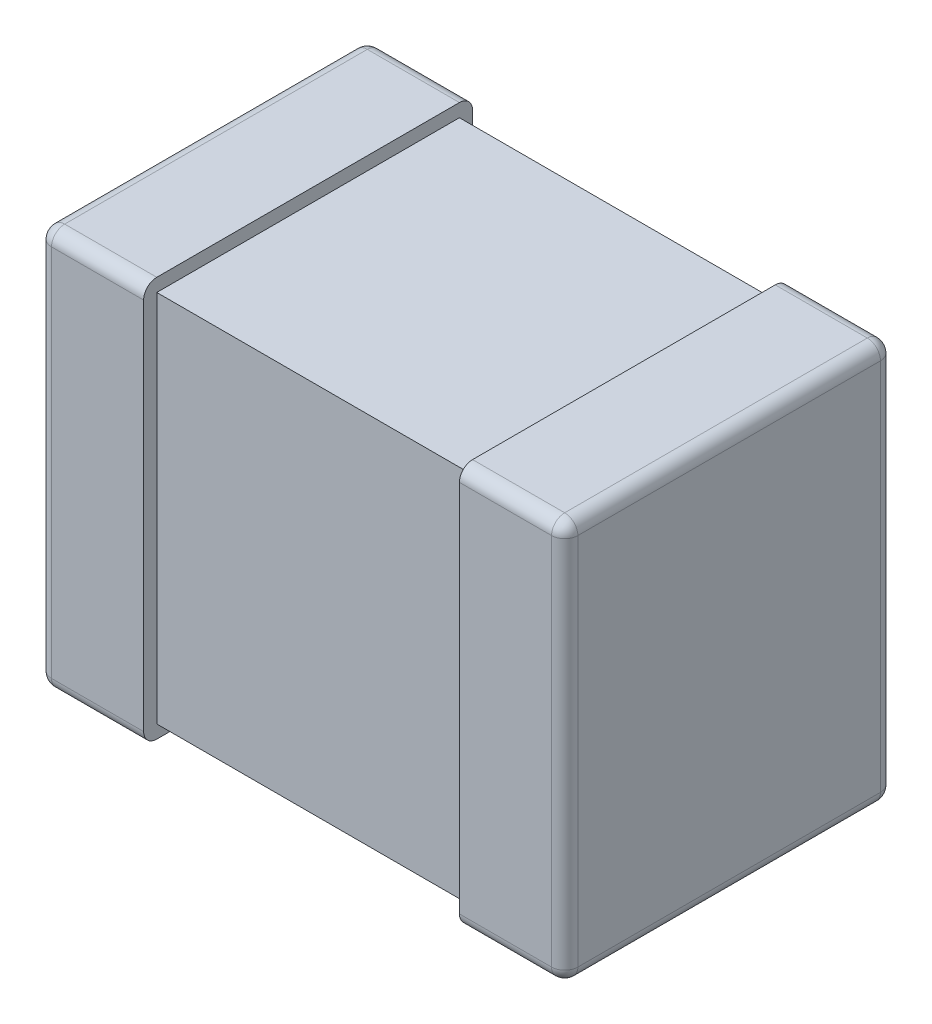
ISO-10303-21;
HEADER;
FILE_DESCRIPTION(('STEP AP214'),'2;1');
FILE_NAME('part.step','',(''),(''),'','','');
FILE_SCHEMA(('AUTOMOTIVE_DESIGN { 1 0 10303 214 1 1 1 1 }'));
ENDSEC;
DATA;
#1=APPLICATION_CONTEXT('core data for automotive mechanical design processes');
#2=APPLICATION_PROTOCOL_DEFINITION('international standard','automotive_design',2000,#1);
#3=PRODUCT_CONTEXT('',#1,'mechanical');
#4=PRODUCT('Part','Part','',(#3));
#5=PRODUCT_RELATED_PRODUCT_CATEGORY('part','',(#4));
#6=PRODUCT_DEFINITION_FORMATION('','',#4);
#7=PRODUCT_DEFINITION_CONTEXT('part definition',#1,'design');
#8=PRODUCT_DEFINITION('design','',#6,#7);
#9=PRODUCT_DEFINITION_SHAPE('','',#8);
#10=(LENGTH_UNIT() NAMED_UNIT(*) SI_UNIT(.MILLI.,.METRE.));
#11=(NAMED_UNIT(*) PLANE_ANGLE_UNIT() SI_UNIT($,.RADIAN.));
#12=(NAMED_UNIT(*) SI_UNIT($,.STERADIAN.) SOLID_ANGLE_UNIT());
#13=UNCERTAINTY_MEASURE_WITH_UNIT(LENGTH_MEASURE(1.E-05),#10,'distance_accuracy_value','');
#14=(GEOMETRIC_REPRESENTATION_CONTEXT(3) GLOBAL_UNCERTAINTY_ASSIGNED_CONTEXT((#13)) GLOBAL_UNIT_ASSIGNED_CONTEXT((#10,
#11,#12)) REPRESENTATION_CONTEXT('',''));
#15=CARTESIAN_POINT('',(0.,0.,0.));
#16=DIRECTION('',(0.,0.,1.));
#17=DIRECTION('',(1.,0.,0.));
#18=AXIS2_PLACEMENT_3D('',#15,#16,#17);
#19=CARTESIAN_POINT('',(-1.,1.52,-0.625));
#20=DIRECTION('',(1.,0.,0.));
#21=DIRECTION('',(0.,0.,-1.));
#22=AXIS2_PLACEMENT_3D('',#19,#20,#21);
#23=PLANE('',#22);
#24=DIRECTION('',(0.,-1.,0.));
#25=VECTOR('',#24,1.);
#26=CARTESIAN_POINT('',(-1.,1.52,-0.575));
#27=LINE('',#26,#25);
#28=CARTESIAN_POINT('',(-1.,0.0499999999999999,-0.575));
#29=VERTEX_POINT('',#28);
#30=CARTESIAN_POINT('',(-1.,1.47,-0.575));
#31=VERTEX_POINT('',#30);
#32=EDGE_CURVE('E436',#29,#31,#27,.F.);
#33=ORIENTED_EDGE('',*,*,#32,.F.);
#34=DIRECTION('',(0.,0.,1.));
#35=VECTOR('',#34,1.);
#36=CARTESIAN_POINT('',(-1.,0.0499999999999999,-0.625));
#37=LINE('',#36,#35);
#38=CARTESIAN_POINT('',(-1.,0.0499999999999999,0.575));
#39=VERTEX_POINT('',#38);
#40=EDGE_CURVE('E318',#39,#29,#37,.F.);
#41=ORIENTED_EDGE('',*,*,#40,.F.);
#42=DIRECTION('',(0.,-1.,0.));
#43=VECTOR('',#42,1.);
#44=CARTESIAN_POINT('',(-1.,1.52,0.575));
#45=LINE('',#44,#43);
#46=CARTESIAN_POINT('',(-1.,1.47,0.575));
#47=VERTEX_POINT('',#46);
#48=EDGE_CURVE('E447',#47,#39,#45,.T.);
#49=ORIENTED_EDGE('',*,*,#48,.F.);
#50=DIRECTION('',(0.,0.,-1.));
#51=VECTOR('',#50,1.);
#52=CARTESIAN_POINT('',(-1.,1.47,0.625));
#53=LINE('',#52,#51);
#54=EDGE_CURVE('E368',#31,#47,#53,.F.);
#55=ORIENTED_EDGE('',*,*,#54,.F.);
#56=EDGE_LOOP('',(#33,#41,#49,#55));
#57=FACE_BOUND('',#56,.T.);
#58=ADVANCED_FACE('F16',(#57),#23,.F.);
#59=CARTESIAN_POINT('',(1.,1.52,-0.625));
#60=DIRECTION('',(-1.,0.,0.));
#61=DIRECTION('',(0.,0.,1.));
#62=AXIS2_PLACEMENT_3D('',#59,#60,#61);
#63=PLANE('',#62);
#64=DIRECTION('',(0.,-1.,0.));
#65=VECTOR('',#64,1.);
#66=CARTESIAN_POINT('',(1.,1.52,0.575));
#67=LINE('',#66,#65);
#68=CARTESIAN_POINT('',(1.,0.0499999999999999,0.575));
#69=VERTEX_POINT('',#68);
#70=CARTESIAN_POINT('',(1.,1.47,0.575));
#71=VERTEX_POINT('',#70);
#72=EDGE_CURVE('E325',#69,#71,#67,.F.);
#73=ORIENTED_EDGE('',*,*,#72,.F.);
#74=DIRECTION('',(0.,0.,-1.));
#75=VECTOR('',#74,1.);
#76=CARTESIAN_POINT('',(1.,0.0499999999999999,-0.625));
#77=LINE('',#76,#75);
#78=CARTESIAN_POINT('',(1.,0.0499999999999999,-0.575));
#79=VERTEX_POINT('',#78);
#80=EDGE_CURVE('E317',#79,#69,#77,.F.);
#81=ORIENTED_EDGE('',*,*,#80,.F.);
#82=DIRECTION('',(0.,-1.,0.));
#83=VECTOR('',#82,1.);
#84=CARTESIAN_POINT('',(1.,1.52,-0.575));
#85=LINE('',#84,#83);
#86=CARTESIAN_POINT('',(1.,1.47,-0.575));
#87=VERTEX_POINT('',#86);
#88=EDGE_CURVE('E186',#87,#79,#85,.T.);
#89=ORIENTED_EDGE('',*,*,#88,.F.);
#90=DIRECTION('',(0.,0.,1.));
#91=VECTOR('',#90,1.);
#92=CARTESIAN_POINT('',(1.,1.47,0.625));
#93=LINE('',#92,#91);
#94=EDGE_CURVE('E417',#71,#87,#93,.F.);
#95=ORIENTED_EDGE('',*,*,#94,.F.);
#96=EDGE_LOOP('',(#73,#81,#89,#95));
#97=FACE_BOUND('',#96,.T.);
#98=ADVANCED_FACE('F404',(#97),#63,.F.);
#99=CARTESIAN_POINT('',(-0.95,0.05,0.575));
#100=DIRECTION('',(1.,0.,0.));
#101=DIRECTION('',(0.,0.,-1.));
#102=AXIS2_PLACEMENT_3D('',#99,#100,#101);
#103=SPHERICAL_SURFACE('',#102,0.05);
#104=CARTESIAN_POINT('',(-0.95,0.0499999999999999,0.575));
#105=DIRECTION('',(0.,-1.,0.));
#106=DIRECTION('',(0.,0.,-1.));
#107=AXIS2_PLACEMENT_3D('',#104,#105,#106);
#108=CIRCLE('',#107,0.05);
#109=CARTESIAN_POINT('',(-0.95,0.0499999999999999,0.625));
#110=VERTEX_POINT('',#109);
#111=EDGE_CURVE('E450',#39,#110,#108,.F.);
#112=ORIENTED_EDGE('',*,*,#111,.F.);
#113=CARTESIAN_POINT('',(-0.95,0.0499999999999999,0.575));
#114=DIRECTION('',(0.,0.,1.));
#115=DIRECTION('',(1.,0.,0.));
#116=AXIS2_PLACEMENT_3D('',#113,#114,#115);
#117=CIRCLE('',#116,0.05);
#118=CARTESIAN_POINT('',(-0.95,0.,0.575));
#119=VERTEX_POINT('',#118);
#120=EDGE_CURVE('E328',#119,#39,#117,.F.);
#121=ORIENTED_EDGE('',*,*,#120,.F.);
#122=CARTESIAN_POINT('',(-0.95,0.0499999999999999,0.575));
#123=DIRECTION('',(1.,0.,0.));
#124=DIRECTION('',(0.,0.,-1.));
#125=AXIS2_PLACEMENT_3D('',#122,#123,#124);
#126=CIRCLE('',#125,0.05);
#127=EDGE_CURVE('E321',#110,#119,#126,.T.);
#128=ORIENTED_EDGE('',*,*,#127,.F.);
#129=EDGE_LOOP('',(#112,#121,#128));
#130=FACE_BOUND('',#129,.T.);
#131=ADVANCED_FACE('F400',(#130),#103,.T.);
#132=CARTESIAN_POINT('',(-0.95,1.52,0.575));
#133=DIRECTION('',(0.,-1.,0.));
#134=DIRECTION('',(0.,0.,-1.));
#135=AXIS2_PLACEMENT_3D('',#132,#133,#134);
#136=CYLINDRICAL_SURFACE('',#135,0.05);
#137=CARTESIAN_POINT('',(-0.95,1.47,0.575));
#138=DIRECTION('',(0.,-1.,0.));
#139=DIRECTION('',(1.,0.,0.));
#140=AXIS2_PLACEMENT_3D('',#137,#138,#139);
#141=CIRCLE('',#140,0.05);
#142=CARTESIAN_POINT('',(-0.95,1.47,0.625));
#143=VERTEX_POINT('',#142);
#144=EDGE_CURVE('E382',#47,#143,#141,.F.);
#145=ORIENTED_EDGE('',*,*,#144,.F.);
#146=ORIENTED_EDGE('',*,*,#48,.T.);
#147=ORIENTED_EDGE('',*,*,#111,.T.);
#148=DIRECTION('',(0.,1.,0.));
#149=VECTOR('',#148,1.);
#150=CARTESIAN_POINT('',(-0.95,1.52,0.625));
#151=LINE('',#150,#149);
#152=EDGE_CURVE('E376',#110,#143,#151,.T.);
#153=ORIENTED_EDGE('',*,*,#152,.T.);
#154=EDGE_LOOP('',(#145,#146,#147,#153));
#155=FACE_BOUND('',#154,.T.);
#156=ADVANCED_FACE('F396',(#155),#136,.T.);
#157=CARTESIAN_POINT('',(-0.95,1.47,0.575));
#158=DIRECTION('',(1.,0.,0.));
#159=DIRECTION('',(0.,0.,-1.));
#160=AXIS2_PLACEMENT_3D('',#157,#158,#159);
#161=SPHERICAL_SURFACE('',#160,0.05);
#162=CARTESIAN_POINT('',(-0.95,1.47,0.575));
#163=DIRECTION('',(-1.,0.,0.));
#164=DIRECTION('',(0.,0.,1.));
#165=AXIS2_PLACEMENT_3D('',#162,#163,#164);
#166=CIRCLE('',#165,0.05);
#167=CARTESIAN_POINT('',(-0.95,1.52,0.575));
#168=VERTEX_POINT('',#167);
#169=EDGE_CURVE('E371',#168,#143,#166,.F.);
#170=ORIENTED_EDGE('',*,*,#169,.F.);
#171=CARTESIAN_POINT('',(-0.95,1.47,0.575));
#172=DIRECTION('',(0.,0.,-1.));
#173=DIRECTION('',(-1.,0.,0.));
#174=AXIS2_PLACEMENT_3D('',#171,#172,#173);
#175=CIRCLE('',#174,0.05);
#176=EDGE_CURVE('E379',#47,#168,#175,.T.);
#177=ORIENTED_EDGE('',*,*,#176,.F.);
#178=ORIENTED_EDGE('',*,*,#144,.T.);
#179=EDGE_LOOP('',(#170,#177,#178));
#180=FACE_BOUND('',#179,.T.);
#181=ADVANCED_FACE('F393',(#180),#161,.T.);
#182=CARTESIAN_POINT('',(-0.95,1.47,0.625));
#183=DIRECTION('',(0.,0.,-1.));
#184=DIRECTION('',(-1.,0.,0.));
#185=AXIS2_PLACEMENT_3D('',#182,#183,#184);
#186=CYLINDRICAL_SURFACE('',#185,0.05);
#187=CARTESIAN_POINT('',(-0.95,1.47,-0.575));
#188=DIRECTION('',(0.,0.,1.));
#189=DIRECTION('',(1.,0.,0.));
#190=AXIS2_PLACEMENT_3D('',#187,#188,#189);
#191=CIRCLE('',#190,0.05);
#192=CARTESIAN_POINT('',(-0.95,1.52,-0.575));
#193=VERTEX_POINT('',#192);
#194=EDGE_CURVE('E364',#31,#193,#191,.F.);
#195=ORIENTED_EDGE('',*,*,#194,.F.);
#196=ORIENTED_EDGE('',*,*,#54,.T.);
#197=ORIENTED_EDGE('',*,*,#176,.T.);
#198=DIRECTION('',(0.,0.,1.));
#199=VECTOR('',#198,1.);
#200=CARTESIAN_POINT('',(-0.95,1.52,0.625));
#201=LINE('',#200,#199);
#202=EDGE_CURVE('E571',#193,#168,#201,.T.);
#203=ORIENTED_EDGE('',*,*,#202,.F.);
#204=EDGE_LOOP('',(#195,#196,#197,#203));
#205=FACE_BOUND('',#204,.T.);
#206=ADVANCED_FACE('F356',(#205),#186,.T.);
#207=CARTESIAN_POINT('',(-0.95,1.47,-0.575));
#208=DIRECTION('',(1.,0.,0.));
#209=DIRECTION('',(0.,0.,-1.));
#210=AXIS2_PLACEMENT_3D('',#207,#208,#209);
#211=SPHERICAL_SURFACE('',#210,0.05);
#212=CARTESIAN_POINT('',(-0.95,1.47,-0.575));
#213=DIRECTION('',(1.,0.,0.));
#214=DIRECTION('',(0.,0.,-1.));
#215=AXIS2_PLACEMENT_3D('',#212,#213,#214);
#216=CIRCLE('',#215,0.05);
#217=CARTESIAN_POINT('',(-0.95,1.47,-0.625));
#218=VERTEX_POINT('',#217);
#219=EDGE_CURVE('E565',#218,#193,#216,.T.);
#220=ORIENTED_EDGE('',*,*,#219,.F.);
#221=CARTESIAN_POINT('',(-0.95,1.47,-0.575));
#222=DIRECTION('',(0.,-1.,0.));
#223=DIRECTION('',(0.,0.,-1.));
#224=AXIS2_PLACEMENT_3D('',#221,#222,#223);
#225=CIRCLE('',#224,0.05);
#226=EDGE_CURVE('E367',#31,#218,#225,.T.);
#227=ORIENTED_EDGE('',*,*,#226,.F.);
#228=ORIENTED_EDGE('',*,*,#194,.T.);
#229=EDGE_LOOP('',(#220,#227,#228));
#230=FACE_BOUND('',#229,.T.);
#231=ADVANCED_FACE('F351',(#230),#211,.T.);
#232=CARTESIAN_POINT('',(-0.95,1.52,-0.575));
#233=DIRECTION('',(0.,-1.,0.));
#234=DIRECTION('',(0.,0.,-1.));
#235=AXIS2_PLACEMENT_3D('',#232,#233,#234);
#236=CYLINDRICAL_SURFACE('',#235,0.05);
#237=CARTESIAN_POINT('',(-0.95,0.05,-0.575));
#238=DIRECTION('',(0.,1.,0.));
#239=DIRECTION('',(1.,0.,0.));
#240=AXIS2_PLACEMENT_3D('',#237,#238,#239);
#241=CIRCLE('',#240,0.05);
#242=CARTESIAN_POINT('',(-0.95,0.0499999999999999,-0.625));
#243=VERTEX_POINT('',#242);
#244=EDGE_CURVE('E332',#29,#243,#241,.F.);
#245=ORIENTED_EDGE('',*,*,#244,.F.);
#246=ORIENTED_EDGE('',*,*,#32,.T.);
#247=ORIENTED_EDGE('',*,*,#226,.T.);
#248=DIRECTION('',(0.,1.,0.));
#249=VECTOR('',#248,1.);
#250=CARTESIAN_POINT('',(-0.95,1.52,-0.625));
#251=LINE('',#250,#249);
#252=EDGE_CURVE('E303',#218,#243,#251,.F.);
#253=ORIENTED_EDGE('',*,*,#252,.T.);
#254=EDGE_LOOP('',(#245,#246,#247,#253));
#255=FACE_BOUND('',#254,.T.);
#256=ADVANCED_FACE('F347',(#255),#236,.T.);
#257=CARTESIAN_POINT('',(-0.95,0.05,-0.575));
#258=DIRECTION('',(1.,0.,0.));
#259=DIRECTION('',(0.,0.,-1.));
#260=AXIS2_PLACEMENT_3D('',#257,#258,#259);
#261=SPHERICAL_SURFACE('',#260,0.05);
#262=CARTESIAN_POINT('',(-0.95,0.0499999999999999,-0.575));
#263=DIRECTION('',(0.,0.,1.));
#264=DIRECTION('',(1.,0.,0.));
#265=AXIS2_PLACEMENT_3D('',#262,#263,#264);
#266=CIRCLE('',#265,0.05);
#267=CARTESIAN_POINT('',(-0.95,0.,-0.575));
#268=VERTEX_POINT('',#267);
#269=EDGE_CURVE('E314',#29,#268,#266,.T.);
#270=ORIENTED_EDGE('',*,*,#269,.F.);
#271=ORIENTED_EDGE('',*,*,#244,.T.);
#272=CARTESIAN_POINT('',(-0.95,0.0499999999999999,-0.575));
#273=DIRECTION('',(-1.,0.,0.));
#274=DIRECTION('',(0.,0.,1.));
#275=AXIS2_PLACEMENT_3D('',#272,#273,#274);
#276=CIRCLE('',#275,0.05);
#277=EDGE_CURVE('E298',#268,#243,#276,.F.);
#278=ORIENTED_EDGE('',*,*,#277,.F.);
#279=EDGE_LOOP('',(#270,#271,#278));
#280=FACE_BOUND('',#279,.T.);
#281=ADVANCED_FACE('F344',(#280),#261,.T.);
#282=CARTESIAN_POINT('',(-0.95,0.0499999999999999,-0.625));
#283=DIRECTION('',(0.,0.,1.));
#284=DIRECTION('',(1.,0.,0.));
#285=AXIS2_PLACEMENT_3D('',#282,#283,#284);
#286=CYLINDRICAL_SURFACE('',#285,0.05);
#287=ORIENTED_EDGE('',*,*,#269,.T.);
#288=DIRECTION('',(0.,0.,1.));
#289=VECTOR('',#288,1.);
#290=CARTESIAN_POINT('',(-0.95,0.,0.625));
#291=LINE('',#290,#289);
#292=EDGE_CURVE('E306',#268,#119,#291,.T.);
#293=ORIENTED_EDGE('',*,*,#292,.T.);
#294=ORIENTED_EDGE('',*,*,#120,.T.);
#295=ORIENTED_EDGE('',*,*,#40,.T.);
#296=EDGE_LOOP('',(#287,#293,#294,#295));
#297=FACE_BOUND('',#296,.T.);
#298=ADVANCED_FACE('F290',(#297),#286,.T.);
#299=CARTESIAN_POINT('',(0.95,0.05,0.575));
#300=DIRECTION('',(1.,0.,0.));
#301=DIRECTION('',(0.,0.,-1.));
#302=AXIS2_PLACEMENT_3D('',#299,#300,#301);
#303=SPHERICAL_SURFACE('',#302,0.05);
#304=CARTESIAN_POINT('',(0.95,0.0499999999999999,0.575));
#305=DIRECTION('',(0.,0.,-1.));
#306=DIRECTION('',(-1.,0.,0.));
#307=AXIS2_PLACEMENT_3D('',#304,#305,#306);
#308=CIRCLE('',#307,0.05);
#309=CARTESIAN_POINT('',(0.95,0.,0.575));
#310=VERTEX_POINT('',#309);
#311=EDGE_CURVE('E428',#69,#310,#308,.T.);
#312=ORIENTED_EDGE('',*,*,#311,.F.);
#313=CARTESIAN_POINT('',(0.95,0.0499999999999999,0.575));
#314=DIRECTION('',(0.,-1.,0.));
#315=DIRECTION('',(0.,0.,-1.));
#316=AXIS2_PLACEMENT_3D('',#313,#314,#315);
#317=CIRCLE('',#316,0.05);
#318=CARTESIAN_POINT('',(0.95,0.0499999999999999,0.625));
#319=VERTEX_POINT('',#318);
#320=EDGE_CURVE('E414',#319,#69,#317,.F.);
#321=ORIENTED_EDGE('',*,*,#320,.F.);
#322=CARTESIAN_POINT('',(0.95,0.0499999999999999,0.575));
#323=DIRECTION('',(1.,0.,0.));
#324=DIRECTION('',(0.,0.,-1.));
#325=AXIS2_PLACEMENT_3D('',#322,#323,#324);
#326=CIRCLE('',#325,0.05);
#327=EDGE_CURVE('E310',#310,#319,#326,.F.);
#328=ORIENTED_EDGE('',*,*,#327,.F.);
#329=EDGE_LOOP('',(#312,#321,#328));
#330=FACE_BOUND('',#329,.T.);
#331=ADVANCED_FACE('F285',(#330),#303,.T.);
#332=CARTESIAN_POINT('',(0.95,0.0499999999999999,-0.625));
#333=DIRECTION('',(0.,0.,-1.));
#334=DIRECTION('',(-1.,0.,0.));
#335=AXIS2_PLACEMENT_3D('',#332,#333,#334);
#336=CYLINDRICAL_SURFACE('',#335,0.05);
#337=ORIENTED_EDGE('',*,*,#311,.T.);
#338=DIRECTION('',(0.,0.,1.));
#339=VECTOR('',#338,1.);
#340=CARTESIAN_POINT('',(0.95,0.,0.625));
#341=LINE('',#340,#339);
#342=CARTESIAN_POINT('',(0.95,0.,-0.575000000000096));
#343=VERTEX_POINT('',#342);
#344=EDGE_CURVE('E266',#310,#343,#341,.F.);
#345=ORIENTED_EDGE('',*,*,#344,.T.);
#346=CARTESIAN_POINT('',(0.95,0.05,-0.575));
#347=DIRECTION('',(0.,7.66568424341191E-12,-1.));
#348=DIRECTION('',(1.,0.,0.));
#349=AXIS2_PLACEMENT_3D('',#346,#347,#348);
#350=CIRCLE('',#349,0.05);
#351=EDGE_CURVE('E258',#79,#343,#350,.T.);
#352=ORIENTED_EDGE('',*,*,#351,.F.);
#353=ORIENTED_EDGE('',*,*,#80,.T.);
#354=EDGE_LOOP('',(#337,#345,#352,#353));
#355=FACE_BOUND('',#354,.T.);
#356=ADVANCED_FACE('F281',(#355),#336,.T.);
#357=CARTESIAN_POINT('',(0.95,0.05,-0.575));
#358=DIRECTION('',(1.,0.,0.));
#359=DIRECTION('',(0.,0.,-1.));
#360=AXIS2_PLACEMENT_3D('',#357,#358,#359);
#361=SPHERICAL_SURFACE('',#360,0.05);
#362=CARTESIAN_POINT('',(0.95,0.0499999999999999,-0.575));
#363=DIRECTION('',(0.,-1.,0.));
#364=DIRECTION('',(0.,0.,-1.));
#365=AXIS2_PLACEMENT_3D('',#362,#363,#364);
#366=CIRCLE('',#365,0.05);
#367=CARTESIAN_POINT('',(0.95,0.0499999999999999,-0.625));
#368=VERTEX_POINT('',#367);
#369=EDGE_CURVE('E201',#79,#368,#366,.F.);
#370=ORIENTED_EDGE('',*,*,#369,.F.);
#371=ORIENTED_EDGE('',*,*,#351,.T.);
#372=CARTESIAN_POINT('',(0.95,0.0499999999999999,-0.575));
#373=DIRECTION('',(-1.,0.,0.));
#374=DIRECTION('',(0.,0.,1.));
#375=AXIS2_PLACEMENT_3D('',#372,#373,#374);
#376=CIRCLE('',#375,0.05);
#377=EDGE_CURVE('E261',#368,#343,#376,.T.);
#378=ORIENTED_EDGE('',*,*,#377,.F.);
#379=EDGE_LOOP('',(#370,#371,#378));
#380=FACE_BOUND('',#379,.T.);
#381=ADVANCED_FACE('F278',(#380),#361,.T.);
#382=CARTESIAN_POINT('',(0.95,1.52,-0.575));
#383=DIRECTION('',(0.,-1.,0.));
#384=DIRECTION('',(0.,0.,-1.));
#385=AXIS2_PLACEMENT_3D('',#382,#383,#384);
#386=CYLINDRICAL_SURFACE('',#385,0.05);
#387=CARTESIAN_POINT('',(0.95,1.47,-0.575));
#388=DIRECTION('',(0.,1.,0.));
#389=DIRECTION('',(1.,0.,0.));
#390=AXIS2_PLACEMENT_3D('',#387,#388,#389);
#391=CIRCLE('',#390,0.05);
#392=CARTESIAN_POINT('',(0.95,1.47,-0.625));
#393=VERTEX_POINT('',#392);
#394=EDGE_CURVE('E175',#87,#393,#391,.T.);
#395=ORIENTED_EDGE('',*,*,#394,.F.);
#396=ORIENTED_EDGE('',*,*,#88,.T.);
#397=ORIENTED_EDGE('',*,*,#369,.T.);
#398=DIRECTION('',(0.,1.,0.));
#399=VECTOR('',#398,1.);
#400=CARTESIAN_POINT('',(0.95,1.52,-0.625));
#401=LINE('',#400,#399);
#402=EDGE_CURVE('E196',#368,#393,#401,.T.);
#403=ORIENTED_EDGE('',*,*,#402,.T.);
#404=EDGE_LOOP('',(#395,#396,#397,#403));
#405=FACE_BOUND('',#404,.T.);
#406=ADVANCED_FACE('F199',(#405),#386,.T.);
#407=CARTESIAN_POINT('',(0.95,1.47,-0.575));
#408=DIRECTION('',(1.,0.,0.));
#409=DIRECTION('',(0.,0.,-1.));
#410=AXIS2_PLACEMENT_3D('',#407,#408,#409);
#411=SPHERICAL_SURFACE('',#410,0.05);
#412=CARTESIAN_POINT('',(0.95,1.47,-0.575));
#413=DIRECTION('',(1.,0.,0.));
#414=DIRECTION('',(0.,0.,-1.));
#415=AXIS2_PLACEMENT_3D('',#412,#413,#414);
#416=CIRCLE('',#415,0.05);
#417=CARTESIAN_POINT('',(0.95,1.52,-0.575));
#418=VERTEX_POINT('',#417);
#419=EDGE_CURVE('E178',#418,#393,#416,.F.);
#420=ORIENTED_EDGE('',*,*,#419,.F.);
#421=CARTESIAN_POINT('',(0.95,1.47,-0.575));
#422=DIRECTION('',(0.,0.,1.));
#423=DIRECTION('',(1.,0.,0.));
#424=AXIS2_PLACEMENT_3D('',#421,#422,#423);
#425=CIRCLE('',#424,0.0499999999999999);
#426=EDGE_CURVE('E180',#87,#418,#425,.T.);
#427=ORIENTED_EDGE('',*,*,#426,.F.);
#428=ORIENTED_EDGE('',*,*,#394,.T.);
#429=EDGE_LOOP('',(#420,#427,#428));
#430=FACE_BOUND('',#429,.T.);
#431=ADVANCED_FACE('F177',(#430),#411,.T.);
#432=CARTESIAN_POINT('',(0.95,1.47,0.625));
#433=DIRECTION('',(0.,0.,1.));
#434=DIRECTION('',(1.,0.,0.));
#435=AXIS2_PLACEMENT_3D('',#432,#433,#434);
#436=CYLINDRICAL_SURFACE('',#435,0.0499999999999999);
#437=CARTESIAN_POINT('',(0.95,1.47,0.575));
#438=DIRECTION('',(0.,0.,1.));
#439=DIRECTION('',(1.,0.,0.));
#440=AXIS2_PLACEMENT_3D('',#437,#438,#439);
#441=CIRCLE('',#440,0.05);
#442=CARTESIAN_POINT('',(0.95,1.52,0.575));
#443=VERTEX_POINT('',#442);
#444=EDGE_CURVE('E232',#71,#443,#441,.T.);
#445=ORIENTED_EDGE('',*,*,#444,.F.);
#446=ORIENTED_EDGE('',*,*,#94,.T.);
#447=ORIENTED_EDGE('',*,*,#426,.T.);
#448=DIRECTION('',(0.,0.,1.));
#449=VECTOR('',#448,1.);
#450=CARTESIAN_POINT('',(0.95,1.52,0.625));
#451=LINE('',#450,#449);
#452=EDGE_CURVE('E213',#443,#418,#451,.F.);
#453=ORIENTED_EDGE('',*,*,#452,.F.);
#454=EDGE_LOOP('',(#445,#446,#447,#453));
#455=FACE_BOUND('',#454,.T.);
#456=ADVANCED_FACE('F240',(#455),#436,.T.);
#457=CARTESIAN_POINT('',(0.95,1.47,0.575));
#458=DIRECTION('',(1.,0.,0.));
#459=DIRECTION('',(0.,0.,-1.));
#460=AXIS2_PLACEMENT_3D('',#457,#458,#459);
#461=SPHERICAL_SURFACE('',#460,0.05);
#462=CARTESIAN_POINT('',(0.95,1.47,0.575));
#463=DIRECTION('',(-1.,0.,0.));
#464=DIRECTION('',(0.,0.,1.));
#465=AXIS2_PLACEMENT_3D('',#462,#463,#464);
#466=CIRCLE('',#465,0.05);
#467=CARTESIAN_POINT('',(0.95,1.47,0.625));
#468=VERTEX_POINT('',#467);
#469=EDGE_CURVE('E222',#468,#443,#466,.T.);
#470=ORIENTED_EDGE('',*,*,#469,.F.);
#471=CARTESIAN_POINT('',(0.95,1.47,0.575));
#472=DIRECTION('',(0.,-1.,0.));
#473=DIRECTION('',(0.,0.,-1.));
#474=AXIS2_PLACEMENT_3D('',#471,#472,#473);
#475=CIRCLE('',#474,0.05);
#476=EDGE_CURVE('E589',#71,#468,#475,.T.);
#477=ORIENTED_EDGE('',*,*,#476,.F.);
#478=ORIENTED_EDGE('',*,*,#444,.T.);
#479=EDGE_LOOP('',(#470,#477,#478));
#480=FACE_BOUND('',#479,.T.);
#481=ADVANCED_FACE('F235',(#480),#461,.T.);
#482=CARTESIAN_POINT('',(0.95,1.52,0.575));
#483=DIRECTION('',(0.,-1.,0.));
#484=DIRECTION('',(0.,0.,-1.));
#485=AXIS2_PLACEMENT_3D('',#482,#483,#484);
#486=CYLINDRICAL_SURFACE('',#485,0.05);
#487=ORIENTED_EDGE('',*,*,#320,.T.);
#488=ORIENTED_EDGE('',*,*,#72,.T.);
#489=ORIENTED_EDGE('',*,*,#476,.T.);
#490=DIRECTION('',(0.,1.,0.));
#491=VECTOR('',#490,1.);
#492=CARTESIAN_POINT('',(0.95,1.52,0.625));
#493=LINE('',#492,#491);
#494=EDGE_CURVE('E499',#468,#319,#493,.F.);
#495=ORIENTED_EDGE('',*,*,#494,.T.);
#496=EDGE_LOOP('',(#487,#488,#489,#495));
#497=FACE_BOUND('',#496,.T.);
#498=ADVANCED_FACE('F239',(#497),#486,.T.);
#499=CARTESIAN_POINT('',(-1.,0.0499999999999999,0.575));
#500=DIRECTION('',(1.,0.,0.));
#501=DIRECTION('',(0.,0.,-1.));
#502=AXIS2_PLACEMENT_3D('',#499,#500,#501);
#503=CYLINDRICAL_SURFACE('',#502,0.05);
#504=ORIENTED_EDGE('',*,*,#127,.T.);
#505=DIRECTION('',(1.,0.,0.));
#506=VECTOR('',#505,1.);
#507=CARTESIAN_POINT('',(-1.,0.,0.575));
#508=LINE('',#507,#506);
#509=CARTESIAN_POINT('',(-0.6,0.,0.575));
#510=VERTEX_POINT('',#509);
#511=EDGE_CURVE('E546',#119,#510,#508,.T.);
#512=ORIENTED_EDGE('',*,*,#511,.T.);
#513=CARTESIAN_POINT('',(-0.6,0.0499999999999999,0.575));
#514=DIRECTION('',(1.,0.,0.));
#515=DIRECTION('',(0.,0.,-1.));
#516=AXIS2_PLACEMENT_3D('',#513,#514,#515);
#517=CIRCLE('',#516,0.05);
#518=CARTESIAN_POINT('',(-0.6,0.0499999999999999,0.625));
#519=VERTEX_POINT('',#518);
#520=EDGE_CURVE('E487',#510,#519,#517,.F.);
#521=ORIENTED_EDGE('',*,*,#520,.T.);
#522=DIRECTION('',(-1.,0.,0.));
#523=VECTOR('',#522,1.);
#524=CARTESIAN_POINT('',(-1.,0.0499999999999999,0.625));
#525=LINE('',#524,#523);
#526=EDGE_CURVE('E324',#519,#110,#525,.T.);
#527=ORIENTED_EDGE('',*,*,#526,.T.);
#528=EDGE_LOOP('',(#504,#512,#521,#527));
#529=FACE_BOUND('',#528,.T.);
#530=ADVANCED_FACE('F668',(#529),#503,.T.);
#531=CARTESIAN_POINT('',(-1.,1.52,0.625));
#532=DIRECTION('',(0.,0.,-1.));
#533=DIRECTION('',(-1.,0.,0.));
#534=AXIS2_PLACEMENT_3D('',#531,#532,#533);
#535=PLANE('',#534);
#536=ORIENTED_EDGE('',*,*,#526,.F.);
#537=DIRECTION('',(0.,1.,0.));
#538=VECTOR('',#537,1.);
#539=CARTESIAN_POINT('',(-0.6,-0.219603614150421,0.625));
#540=LINE('',#539,#538);
#541=CARTESIAN_POINT('',(-0.6,1.47,0.625));
#542=VERTEX_POINT('',#541);
#543=EDGE_CURVE('E486',#519,#542,#540,.T.);
#544=ORIENTED_EDGE('',*,*,#543,.T.);
#545=DIRECTION('',(-1.,0.,0.));
#546=VECTOR('',#545,1.);
#547=CARTESIAN_POINT('',(-1.,1.47,0.625));
#548=LINE('',#547,#546);
#549=EDGE_CURVE('E375',#143,#542,#548,.F.);
#550=ORIENTED_EDGE('',*,*,#549,.F.);
#551=ORIENTED_EDGE('',*,*,#152,.F.);
#552=EDGE_LOOP('',(#536,#544,#550,#551));
#553=FACE_BOUND('',#552,.T.);
#554=ADVANCED_FACE('F665',(#553),#535,.F.);
#555=CARTESIAN_POINT('',(-1.,1.47,0.575));
#556=DIRECTION('',(-1.,0.,0.));
#557=DIRECTION('',(0.,0.,1.));
#558=AXIS2_PLACEMENT_3D('',#555,#556,#557);
#559=CYLINDRICAL_SURFACE('',#558,0.05);
#560=ORIENTED_EDGE('',*,*,#169,.T.);
#561=ORIENTED_EDGE('',*,*,#549,.T.);
#562=CARTESIAN_POINT('',(-0.6,1.47,0.575));
#563=DIRECTION('',(-1.,0.,0.));
#564=DIRECTION('',(0.,0.,1.));
#565=AXIS2_PLACEMENT_3D('',#562,#563,#564);
#566=CIRCLE('',#565,0.05);
#567=CARTESIAN_POINT('',(-0.6,1.52,0.575));
#568=VERTEX_POINT('',#567);
#569=EDGE_CURVE('E483',#542,#568,#566,.T.);
#570=ORIENTED_EDGE('',*,*,#569,.T.);
#571=DIRECTION('',(1.,0.,0.));
#572=VECTOR('',#571,1.);
#573=CARTESIAN_POINT('',(-1.,1.52,0.575));
#574=LINE('',#573,#572);
#575=EDGE_CURVE('E568',#168,#568,#574,.T.);
#576=ORIENTED_EDGE('',*,*,#575,.F.);
#577=EDGE_LOOP('',(#560,#561,#570,#576));
#578=FACE_BOUND('',#577,.T.);
#579=ADVANCED_FACE('F660',(#578),#559,.T.);
#580=CARTESIAN_POINT('',(-1.,1.52,0.625));
#581=DIRECTION('',(0.,1.,0.));
#582=DIRECTION('',(0.,0.,1.));
#583=AXIS2_PLACEMENT_3D('',#580,#581,#582);
#584=PLANE('',#583);
#585=ORIENTED_EDGE('',*,*,#202,.T.);
#586=ORIENTED_EDGE('',*,*,#575,.T.);
#587=DIRECTION('',(0.,0.,1.));
#588=VECTOR('',#587,1.);
#589=CARTESIAN_POINT('',(-0.6,1.52,-0.625));
#590=LINE('',#589,#588);
#591=CARTESIAN_POINT('',(-0.6,1.52,-0.575));
#592=VERTEX_POINT('',#591);
#593=EDGE_CURVE('E482',#568,#592,#590,.F.);
#594=ORIENTED_EDGE('',*,*,#593,.T.);
#595=DIRECTION('',(1.,0.,0.));
#596=VECTOR('',#595,1.);
#597=CARTESIAN_POINT('',(-1.,1.52,-0.575));
#598=LINE('',#597,#596);
#599=EDGE_CURVE('E560',#193,#592,#598,.T.);
#600=ORIENTED_EDGE('',*,*,#599,.F.);
#601=EDGE_LOOP('',(#585,#586,#594,#600));
#602=FACE_BOUND('',#601,.T.);
#603=ADVANCED_FACE('F649',(#602),#584,.T.);
#604=CARTESIAN_POINT('',(-1.,1.47,-0.575));
#605=DIRECTION('',(1.,0.,0.));
#606=DIRECTION('',(0.,0.,-1.));
#607=AXIS2_PLACEMENT_3D('',#604,#605,#606);
#608=CYLINDRICAL_SURFACE('',#607,0.05);
#609=ORIENTED_EDGE('',*,*,#219,.T.);
#610=ORIENTED_EDGE('',*,*,#599,.T.);
#611=CARTESIAN_POINT('',(-0.6,1.47,-0.575));
#612=DIRECTION('',(1.,0.,0.));
#613=DIRECTION('',(0.,0.,-1.));
#614=AXIS2_PLACEMENT_3D('',#611,#612,#613);
#615=CIRCLE('',#614,0.05);
#616=CARTESIAN_POINT('',(-0.6,1.47,-0.625));
#617=VERTEX_POINT('',#616);
#618=EDGE_CURVE('E478',#592,#617,#615,.F.);
#619=ORIENTED_EDGE('',*,*,#618,.T.);
#620=DIRECTION('',(1.,0.,0.));
#621=VECTOR('',#620,1.);
#622=CARTESIAN_POINT('',(-1.,1.47,-0.625));
#623=LINE('',#622,#621);
#624=EDGE_CURVE('E338',#617,#218,#623,.F.);
#625=ORIENTED_EDGE('',*,*,#624,.T.);
#626=EDGE_LOOP('',(#609,#610,#619,#625));
#627=FACE_BOUND('',#626,.T.);
#628=ADVANCED_FACE('F683',(#627),#608,.T.);
#629=CARTESIAN_POINT('',(-1.,1.52,-0.625));
#630=DIRECTION('',(0.,0.,1.));
#631=DIRECTION('',(1.,0.,0.));
#632=AXIS2_PLACEMENT_3D('',#629,#630,#631);
#633=PLANE('',#632);
#634=DIRECTION('',(-1.,0.,0.));
#635=VECTOR('',#634,1.);
#636=CARTESIAN_POINT('',(-1.,0.0499999999999999,-0.625));
#637=LINE('',#636,#635);
#638=CARTESIAN_POINT('',(-0.6,0.0499999999999999,-0.625));
#639=VERTEX_POINT('',#638);
#640=EDGE_CURVE('E302',#243,#639,#637,.F.);
#641=ORIENTED_EDGE('',*,*,#640,.F.);
#642=ORIENTED_EDGE('',*,*,#252,.F.);
#643=ORIENTED_EDGE('',*,*,#624,.F.);
#644=DIRECTION('',(0.,1.,0.));
#645=VECTOR('',#644,1.);
#646=CARTESIAN_POINT('',(-0.6,-0.219603614150421,-0.625));
#647=LINE('',#646,#645);
#648=EDGE_CURVE('E477',#617,#639,#647,.F.);
#649=ORIENTED_EDGE('',*,*,#648,.T.);
#650=EDGE_LOOP('',(#641,#642,#643,#649));
#651=FACE_BOUND('',#650,.T.);
#652=ADVANCED_FACE('F679',(#651),#633,.F.);
#653=CARTESIAN_POINT('',(-1.,0.0499999999999999,-0.575));
#654=DIRECTION('',(-1.,0.,0.));
#655=DIRECTION('',(0.,0.,1.));
#656=AXIS2_PLACEMENT_3D('',#653,#654,#655);
#657=CYLINDRICAL_SURFACE('',#656,0.05);
#658=ORIENTED_EDGE('',*,*,#277,.T.);
#659=ORIENTED_EDGE('',*,*,#640,.T.);
#660=CARTESIAN_POINT('',(-0.6,0.0499999999999999,-0.575));
#661=DIRECTION('',(-1.,0.,0.));
#662=DIRECTION('',(0.,0.,1.));
#663=AXIS2_PLACEMENT_3D('',#660,#661,#662);
#664=CIRCLE('',#663,0.05);
#665=CARTESIAN_POINT('',(-0.6,0.,-0.575));
#666=VERTEX_POINT('',#665);
#667=EDGE_CURVE('E472',#639,#666,#664,.T.);
#668=ORIENTED_EDGE('',*,*,#667,.T.);
#669=DIRECTION('',(1.,0.,0.));
#670=VECTOR('',#669,1.);
#671=CARTESIAN_POINT('',(-1.,0.,-0.575));
#672=LINE('',#671,#670);
#673=EDGE_CURVE('E311',#666,#268,#672,.F.);
#674=ORIENTED_EDGE('',*,*,#673,.T.);
#675=EDGE_LOOP('',(#658,#659,#668,#674));
#676=FACE_BOUND('',#675,.T.);
#677=ADVANCED_FACE('F675',(#676),#657,.T.);
#678=CARTESIAN_POINT('',(-1.,0.,0.625));
#679=DIRECTION('',(0.,1.,0.));
#680=DIRECTION('',(0.,0.,1.));
#681=AXIS2_PLACEMENT_3D('',#678,#679,#680);
#682=PLANE('',#681);
#683=ORIENTED_EDGE('',*,*,#673,.F.);
#684=DIRECTION('',(0.,0.,1.));
#685=VECTOR('',#684,1.);
#686=CARTESIAN_POINT('',(-0.6,0.,-0.625));
#687=LINE('',#686,#685);
#688=EDGE_CURVE('E476',#666,#510,#687,.T.);
#689=ORIENTED_EDGE('',*,*,#688,.T.);
#690=ORIENTED_EDGE('',*,*,#511,.F.);
#691=ORIENTED_EDGE('',*,*,#292,.F.);
#692=EDGE_LOOP('',(#683,#689,#690,#691));
#693=FACE_BOUND('',#692,.T.);
#694=ADVANCED_FACE('F673',(#693),#682,.F.);
#695=CARTESIAN_POINT('',(-1.,0.0499999999999999,0.575));
#696=DIRECTION('',(1.,0.,0.));
#697=DIRECTION('',(0.,0.,-1.));
#698=AXIS2_PLACEMENT_3D('',#695,#696,#697);
#699=CYLINDRICAL_SURFACE('',#698,0.05);
#700=ORIENTED_EDGE('',*,*,#327,.T.);
#701=DIRECTION('',(-1.,0.,0.));
#702=VECTOR('',#701,1.);
#703=CARTESIAN_POINT('',(-1.,0.0499999999999999,0.625));
#704=LINE('',#703,#702);
#705=CARTESIAN_POINT('',(0.6,0.0499999999999999,0.625));
#706=VERTEX_POINT('',#705);
#707=EDGE_CURVE('E513',#319,#706,#704,.T.);
#708=ORIENTED_EDGE('',*,*,#707,.T.);
#709=CARTESIAN_POINT('',(0.6,0.0499999999999999,0.575));
#710=DIRECTION('',(1.,0.,0.));
#711=DIRECTION('',(0.,0.,-1.));
#712=AXIS2_PLACEMENT_3D('',#709,#710,#711);
#713=CIRCLE('',#712,0.05);
#714=CARTESIAN_POINT('',(0.6,0.,0.575));
#715=VERTEX_POINT('',#714);
#716=EDGE_CURVE('E467',#706,#715,#713,.T.);
#717=ORIENTED_EDGE('',*,*,#716,.T.);
#718=DIRECTION('',(1.,0.,0.));
#719=VECTOR('',#718,1.);
#720=CARTESIAN_POINT('',(-1.,0.,0.575));
#721=LINE('',#720,#719);
#722=EDGE_CURVE('E272',#715,#310,#721,.T.);
#723=ORIENTED_EDGE('',*,*,#722,.T.);
#724=EDGE_LOOP('',(#700,#708,#717,#723));
#725=FACE_BOUND('',#724,.T.);
#726=ADVANCED_FACE('F759',(#725),#699,.T.);
#727=CARTESIAN_POINT('',(-1.,0.,0.625));
#728=DIRECTION('',(0.,1.,0.));
#729=DIRECTION('',(0.,0.,1.));
#730=AXIS2_PLACEMENT_3D('',#727,#728,#729);
#731=PLANE('',#730);
#732=ORIENTED_EDGE('',*,*,#722,.F.);
#733=DIRECTION('',(0.,0.,-1.));
#734=VECTOR('',#733,1.);
#735=CARTESIAN_POINT('',(0.6,0.,-0.625));
#736=LINE('',#735,#734);
#737=CARTESIAN_POINT('',(0.6,0.,-0.575));
#738=VERTEX_POINT('',#737);
#739=EDGE_CURVE('E466',#715,#738,#736,.T.);
#740=ORIENTED_EDGE('',*,*,#739,.T.);
#741=DIRECTION('',(-1.,0.,0.));
#742=VECTOR('',#741,1.);
#743=CARTESIAN_POINT('',(-1.,0.,-0.575));
#744=LINE('',#743,#742);
#745=EDGE_CURVE('E265',#343,#738,#744,.T.);
#746=ORIENTED_EDGE('',*,*,#745,.F.);
#747=ORIENTED_EDGE('',*,*,#344,.F.);
#748=EDGE_LOOP('',(#732,#740,#746,#747));
#749=FACE_BOUND('',#748,.T.);
#750=ADVANCED_FACE('F617',(#749),#731,.F.);
#751=CARTESIAN_POINT('',(-1.,0.0499999999999999,-0.575));
#752=DIRECTION('',(-1.,0.,0.));
#753=DIRECTION('',(0.,0.,1.));
#754=AXIS2_PLACEMENT_3D('',#751,#752,#753);
#755=CYLINDRICAL_SURFACE('',#754,0.05);
#756=ORIENTED_EDGE('',*,*,#377,.T.);
#757=ORIENTED_EDGE('',*,*,#745,.T.);
#758=CARTESIAN_POINT('',(0.6,0.0499999999999999,-0.575));
#759=DIRECTION('',(-1.,0.,0.));
#760=DIRECTION('',(0.,0.,1.));
#761=AXIS2_PLACEMENT_3D('',#758,#759,#760);
#762=CIRCLE('',#761,0.05);
#763=CARTESIAN_POINT('',(0.6,0.0499999999999999,-0.625));
#764=VERTEX_POINT('',#763);
#765=EDGE_CURVE('E462',#738,#764,#762,.F.);
#766=ORIENTED_EDGE('',*,*,#765,.T.);
#767=DIRECTION('',(1.,0.,0.));
#768=VECTOR('',#767,1.);
#769=CARTESIAN_POINT('',(-1.,0.0499999999999999,-0.625));
#770=LINE('',#769,#768);
#771=EDGE_CURVE('E206',#764,#368,#770,.T.);
#772=ORIENTED_EDGE('',*,*,#771,.T.);
#773=EDGE_LOOP('',(#756,#757,#766,#772));
#774=FACE_BOUND('',#773,.T.);
#775=ADVANCED_FACE('F612',(#774),#755,.T.);
#776=CARTESIAN_POINT('',(-1.,1.52,-0.625));
#777=DIRECTION('',(0.,0.,1.));
#778=DIRECTION('',(1.,0.,0.));
#779=AXIS2_PLACEMENT_3D('',#776,#777,#778);
#780=PLANE('',#779);
#781=DIRECTION('',(1.,0.,0.));
#782=VECTOR('',#781,1.);
#783=CARTESIAN_POINT('',(-1.,1.47,-0.625));
#784=LINE('',#783,#782);
#785=CARTESIAN_POINT('',(0.6,1.47,-0.625));
#786=VERTEX_POINT('',#785);
#787=EDGE_CURVE('E19',#393,#786,#784,.F.);
#788=ORIENTED_EDGE('',*,*,#787,.F.);
#789=ORIENTED_EDGE('',*,*,#402,.F.);
#790=ORIENTED_EDGE('',*,*,#771,.F.);
#791=DIRECTION('',(0.,1.,0.));
#792=VECTOR('',#791,1.);
#793=CARTESIAN_POINT('',(0.6,1.73960361415042,-0.625));
#794=LINE('',#793,#792);
#795=EDGE_CURVE('E211',#764,#786,#794,.T.);
#796=ORIENTED_EDGE('',*,*,#795,.T.);
#797=EDGE_LOOP('',(#788,#789,#790,#796));
#798=FACE_BOUND('',#797,.T.);
#799=ADVANCED_FACE('F209',(#798),#780,.F.);
#800=CARTESIAN_POINT('',(-1.,1.47,-0.575));
#801=DIRECTION('',(1.,0.,0.));
#802=DIRECTION('',(0.,0.,-1.));
#803=AXIS2_PLACEMENT_3D('',#800,#801,#802);
#804=CYLINDRICAL_SURFACE('',#803,0.05);
#805=ORIENTED_EDGE('',*,*,#419,.T.);
#806=ORIENTED_EDGE('',*,*,#787,.T.);
#807=CARTESIAN_POINT('',(0.6,1.47,-0.575));
#808=DIRECTION('',(1.,0.,0.));
#809=DIRECTION('',(0.,0.,-1.));
#810=AXIS2_PLACEMENT_3D('',#807,#808,#809);
#811=CIRCLE('',#810,0.05);
#812=CARTESIAN_POINT('',(0.6,1.52,-0.575));
#813=VERTEX_POINT('',#812);
#814=EDGE_CURVE('E459',#786,#813,#811,.T.);
#815=ORIENTED_EDGE('',*,*,#814,.T.);
#816=DIRECTION('',(1.,0.,0.));
#817=VECTOR('',#816,1.);
#818=CARTESIAN_POINT('',(-1.,1.52,-0.575000000000001));
#819=LINE('',#818,#817);
#820=EDGE_CURVE('E194',#418,#813,#819,.F.);
#821=ORIENTED_EDGE('',*,*,#820,.F.);
#822=EDGE_LOOP('',(#805,#806,#815,#821));
#823=FACE_BOUND('',#822,.T.);
#824=ADVANCED_FACE('F190',(#823),#804,.T.);
#825=CARTESIAN_POINT('',(-1.,1.52,0.625));
#826=DIRECTION('',(0.,1.,0.));
#827=DIRECTION('',(0.,0.,1.));
#828=AXIS2_PLACEMENT_3D('',#825,#826,#827);
#829=PLANE('',#828);
#830=ORIENTED_EDGE('',*,*,#452,.T.);
#831=ORIENTED_EDGE('',*,*,#820,.T.);
#832=DIRECTION('',(0.,0.,-1.));
#833=VECTOR('',#832,1.);
#834=CARTESIAN_POINT('',(0.6,1.52,-0.625));
#835=LINE('',#834,#833);
#836=CARTESIAN_POINT('',(0.6,1.52,0.575));
#837=VERTEX_POINT('',#836);
#838=EDGE_CURVE('E458',#813,#837,#835,.F.);
#839=ORIENTED_EDGE('',*,*,#838,.T.);
#840=DIRECTION('',(-1.,0.,0.));
#841=VECTOR('',#840,1.);
#842=CARTESIAN_POINT('',(-1.,1.52,0.575));
#843=LINE('',#842,#841);
#844=EDGE_CURVE('E519',#443,#837,#843,.T.);
#845=ORIENTED_EDGE('',*,*,#844,.F.);
#846=EDGE_LOOP('',(#830,#831,#839,#845));
#847=FACE_BOUND('',#846,.T.);
#848=ADVANCED_FACE('F747',(#847),#829,.T.);
#849=CARTESIAN_POINT('',(-1.,1.47,0.575));
#850=DIRECTION('',(-1.,0.,0.));
#851=DIRECTION('',(0.,0.,1.));
#852=AXIS2_PLACEMENT_3D('',#849,#850,#851);
#853=CYLINDRICAL_SURFACE('',#852,0.05);
#854=ORIENTED_EDGE('',*,*,#469,.T.);
#855=ORIENTED_EDGE('',*,*,#844,.T.);
#856=CARTESIAN_POINT('',(0.6,1.47,0.575));
#857=DIRECTION('',(-1.,0.,0.));
#858=DIRECTION('',(0.,0.,1.));
#859=AXIS2_PLACEMENT_3D('',#856,#857,#858);
#860=CIRCLE('',#859,0.05);
#861=CARTESIAN_POINT('',(0.6,1.47,0.625));
#862=VERTEX_POINT('',#861);
#863=EDGE_CURVE('E453',#837,#862,#860,.F.);
#864=ORIENTED_EDGE('',*,*,#863,.T.);
#865=DIRECTION('',(-1.,0.,0.));
#866=VECTOR('',#865,1.);
#867=CARTESIAN_POINT('',(-1.,1.47,0.625));
#868=LINE('',#867,#866);
#869=EDGE_CURVE('E506',#862,#468,#868,.F.);
#870=ORIENTED_EDGE('',*,*,#869,.T.);
#871=EDGE_LOOP('',(#854,#855,#864,#870));
#872=FACE_BOUND('',#871,.T.);
#873=ADVANCED_FACE('F743',(#872),#853,.T.);
#874=CARTESIAN_POINT('',(-1.,1.52,0.625));
#875=DIRECTION('',(0.,0.,-1.));
#876=DIRECTION('',(-1.,0.,0.));
#877=AXIS2_PLACEMENT_3D('',#874,#875,#876);
#878=PLANE('',#877);
#879=ORIENTED_EDGE('',*,*,#869,.F.);
#880=DIRECTION('',(0.,1.,0.));
#881=VECTOR('',#880,1.);
#882=CARTESIAN_POINT('',(0.6,1.73960361415042,0.625));
#883=LINE('',#882,#881);
#884=EDGE_CURVE('E457',#862,#706,#883,.F.);
#885=ORIENTED_EDGE('',*,*,#884,.T.);
#886=ORIENTED_EDGE('',*,*,#707,.F.);
#887=ORIENTED_EDGE('',*,*,#494,.F.);
#888=EDGE_LOOP('',(#879,#885,#886,#887));
#889=FACE_BOUND('',#888,.T.);
#890=ADVANCED_FACE('F740',(#889),#878,.F.);
#891=CARTESIAN_POINT('',(0.6,-2.50000000000684E-05,-0.575));
#892=DIRECTION('',(0.,0.,1.));
#893=DIRECTION('',(1.,0.,0.));
#894=AXIS2_PLACEMENT_3D('',#891,#892,#893);
#895=PLANE('',#894);
#896=DIRECTION('',(0.,1.,0.));
#897=VECTOR('',#896,1.);
#898=CARTESIAN_POINT('',(-0.6,-0.219603614150421,-0.575));
#899=LINE('',#898,#897);
#900=CARTESIAN_POINT('',(-0.6,0.0499999999999999,-0.575));
#901=VERTEX_POINT('',#900);
#902=CARTESIAN_POINT('',(-0.6,1.47,-0.575));
#903=VERTEX_POINT('',#902);
#904=EDGE_CURVE('E490',#901,#903,#899,.T.);
#905=ORIENTED_EDGE('',*,*,#904,.T.);
#906=DIRECTION('',(1.,0.,0.));
#907=VECTOR('',#906,1.);
#908=CARTESIAN_POINT('',(-0.6,1.47,-0.575000000000001));
#909=LINE('',#908,#907);
#910=CARTESIAN_POINT('',(0.6,1.47,-0.575000000000001));
#911=VERTEX_POINT('',#910);
#912=EDGE_CURVE('E635',#911,#903,#909,.F.);
#913=ORIENTED_EDGE('',*,*,#912,.F.);
#914=DIRECTION('',(0.,1.,0.));
#915=VECTOR('',#914,1.);
#916=CARTESIAN_POINT('',(0.6,1.73960361415042,-0.575000000000001));
#917=LINE('',#916,#915);
#918=CARTESIAN_POINT('',(0.6,0.0499999999999999,-0.575));
#919=VERTEX_POINT('',#918);
#920=EDGE_CURVE('E471',#911,#919,#917,.F.);
#921=ORIENTED_EDGE('',*,*,#920,.T.);
#922=DIRECTION('',(1.,0.,0.));
#923=VECTOR('',#922,1.);
#924=CARTESIAN_POINT('',(-0.6,0.0499999999999999,-0.575));
#925=LINE('',#924,#923);
#926=EDGE_CURVE('E1130',#901,#919,#925,.T.);
#927=ORIENTED_EDGE('',*,*,#926,.F.);
#928=EDGE_LOOP('',(#905,#913,#921,#927));
#929=FACE_BOUND('',#928,.T.);
#930=ADVANCED_FACE('F737',(#929),#895,.F.);
#931=CARTESIAN_POINT('',(-0.6,-0.219603614150421,-0.625));
#932=DIRECTION('',(-1.,0.,0.));
#933=DIRECTION('',(0.,0.,1.));
#934=AXIS2_PLACEMENT_3D('',#931,#932,#933);
#935=PLANE('',#934);
#936=ORIENTED_EDGE('',*,*,#667,.F.);
#937=ORIENTED_EDGE('',*,*,#648,.F.);
#938=ORIENTED_EDGE('',*,*,#618,.F.);
#939=ORIENTED_EDGE('',*,*,#593,.F.);
#940=ORIENTED_EDGE('',*,*,#569,.F.);
#941=ORIENTED_EDGE('',*,*,#543,.F.);
#942=ORIENTED_EDGE('',*,*,#520,.F.);
#943=ORIENTED_EDGE('',*,*,#688,.F.);
#944=EDGE_LOOP('',(#936,#937,#938,#939,#940,#941,#942,#943));
#945=FACE_BOUND('',#944,.T.);
#946=DIRECTION('',(0.,0.,-1.));
#947=VECTOR('',#946,1.);
#948=CARTESIAN_POINT('',(-0.6,0.0499999999999999,-2.48413958593754));
#949=LINE('',#948,#947);
#950=CARTESIAN_POINT('',(-0.6,0.0499999999999999,0.575));
#951=VERTEX_POINT('',#950);
#952=EDGE_CURVE('E1139',#951,#901,#949,.T.);
#953=ORIENTED_EDGE('',*,*,#952,.F.);
#954=DIRECTION('',(0.,1.,0.));
#955=VECTOR('',#954,1.);
#956=CARTESIAN_POINT('',(-0.6,-2.50000000000684E-05,0.575));
#957=LINE('',#956,#955);
#958=CARTESIAN_POINT('',(-0.6,1.47,0.575));
#959=VERTEX_POINT('',#958);
#960=EDGE_CURVE('E1143',#951,#959,#957,.T.);
#961=ORIENTED_EDGE('',*,*,#960,.T.);
#962=DIRECTION('',(0.,0.,1.));
#963=VECTOR('',#962,1.);
#964=CARTESIAN_POINT('',(-0.6,1.47,-2.48413958593754));
#965=LINE('',#964,#963);
#966=EDGE_CURVE('E632',#903,#959,#965,.T.);
#967=ORIENTED_EDGE('',*,*,#966,.F.);
#968=ORIENTED_EDGE('',*,*,#904,.F.);
#969=EDGE_LOOP('',(#953,#961,#967,#968));
#970=FACE_BOUND('',#969,.T.);
#971=ADVANCED_FACE('F655',(#945,#970),#935,.F.);
#972=CARTESIAN_POINT('',(-0.6,1.47,-2.48413958593754));
#973=DIRECTION('',(0.,1.,0.));
#974=DIRECTION('',(0.,0.,1.));
#975=AXIS2_PLACEMENT_3D('',#972,#973,#974);
#976=PLANE('',#975);
#977=DIRECTION('',(-1.,0.,0.));
#978=VECTOR('',#977,1.);
#979=CARTESIAN_POINT('',(-0.6,1.47,0.575));
#980=LINE('',#979,#978);
#981=CARTESIAN_POINT('',(0.6,1.47,0.575));
#982=VERTEX_POINT('',#981);
#983=EDGE_CURVE('E1147',#959,#982,#980,.F.);
#984=ORIENTED_EDGE('',*,*,#983,.T.);
#985=DIRECTION('',(0.,0.,-1.));
#986=VECTOR('',#985,1.);
#987=CARTESIAN_POINT('',(0.6,1.47,-0.625));
#988=LINE('',#987,#986);
#989=EDGE_CURVE('E628',#982,#911,#988,.T.);
#990=ORIENTED_EDGE('',*,*,#989,.T.);
#991=ORIENTED_EDGE('',*,*,#912,.T.);
#992=ORIENTED_EDGE('',*,*,#966,.T.);
#993=EDGE_LOOP('',(#984,#990,#991,#992));
#994=FACE_BOUND('',#993,.T.);
#995=ADVANCED_FACE('F731',(#994),#976,.T.);
#996=CARTESIAN_POINT('',(0.6,1.73960361415042,-0.625));
#997=DIRECTION('',(1.,0.,0.));
#998=DIRECTION('',(0.,0.,-1.));
#999=AXIS2_PLACEMENT_3D('',#996,#997,#998);
#1000=PLANE('',#999);
#1001=ORIENTED_EDGE('',*,*,#863,.F.);
#1002=ORIENTED_EDGE('',*,*,#838,.F.);
#1003=ORIENTED_EDGE('',*,*,#814,.F.);
#1004=ORIENTED_EDGE('',*,*,#795,.F.);
#1005=ORIENTED_EDGE('',*,*,#765,.F.);
#1006=ORIENTED_EDGE('',*,*,#739,.F.);
#1007=ORIENTED_EDGE('',*,*,#716,.F.);
#1008=ORIENTED_EDGE('',*,*,#884,.F.);
#1009=EDGE_LOOP('',(#1001,#1002,#1003,#1004,#1005,#1006,#1007,#1008));
#1010=FACE_BOUND('',#1009,.T.);
#1011=ORIENTED_EDGE('',*,*,#920,.F.);
#1012=ORIENTED_EDGE('',*,*,#989,.F.);
#1013=DIRECTION('',(0.,1.,0.));
#1014=VECTOR('',#1013,1.);
#1015=CARTESIAN_POINT('',(0.6,-2.50000000000684E-05,0.575));
#1016=LINE('',#1015,#1014);
#1017=CARTESIAN_POINT('',(0.6,0.0499999999999999,0.575));
#1018=VERTEX_POINT('',#1017);
#1019=EDGE_CURVE('E26',#982,#1018,#1016,.F.);
#1020=ORIENTED_EDGE('',*,*,#1019,.T.);
#1021=DIRECTION('',(0.,0.,-1.));
#1022=VECTOR('',#1021,1.);
#1023=CARTESIAN_POINT('',(0.6,0.0499999999999999,-2.48413958593754));
#1024=LINE('',#1023,#1022);
#1025=EDGE_CURVE('E34',#919,#1018,#1024,.F.);
#1026=ORIENTED_EDGE('',*,*,#1025,.F.);
#1027=EDGE_LOOP('',(#1011,#1012,#1020,#1026));
#1028=FACE_BOUND('',#1027,.T.);
#1029=ADVANCED_FACE('F725',(#1010,#1028),#1000,.F.);
#1030=CARTESIAN_POINT('',(-0.6,0.0499999999999999,-2.48413958593754));
#1031=DIRECTION('',(0.,-1.,0.));
#1032=DIRECTION('',(0.,0.,-1.));
#1033=AXIS2_PLACEMENT_3D('',#1030,#1031,#1032);
#1034=PLANE('',#1033);
#1035=DIRECTION('',(-1.,0.,0.));
#1036=VECTOR('',#1035,1.);
#1037=CARTESIAN_POINT('',(-0.6,0.0499999999999999,0.575));
#1038=LINE('',#1037,#1036);
#1039=EDGE_CURVE('E11',#1018,#951,#1038,.T.);
#1040=ORIENTED_EDGE('',*,*,#1039,.T.);
#1041=ORIENTED_EDGE('',*,*,#952,.T.);
#1042=ORIENTED_EDGE('',*,*,#926,.T.);
#1043=ORIENTED_EDGE('',*,*,#1025,.T.);
#1044=EDGE_LOOP('',(#1040,#1041,#1042,#1043));
#1045=FACE_BOUND('',#1044,.T.);
#1046=ADVANCED_FACE('F719',(#1045),#1034,.T.);
#1047=CARTESIAN_POINT('',(-0.6,-2.50000000000684E-05,0.575));
#1048=DIRECTION('',(0.,0.,-1.));
#1049=DIRECTION('',(-1.,0.,0.));
#1050=AXIS2_PLACEMENT_3D('',#1047,#1048,#1049);
#1051=PLANE('',#1050);
#1052=ORIENTED_EDGE('',*,*,#1019,.F.);
#1053=ORIENTED_EDGE('',*,*,#983,.F.);
#1054=ORIENTED_EDGE('',*,*,#960,.F.);
#1055=ORIENTED_EDGE('',*,*,#1039,.F.);
#1056=EDGE_LOOP('',(#1052,#1053,#1054,#1055));
#1057=FACE_BOUND('',#1056,.T.);
#1058=ADVANCED_FACE('F717',(#1057),#1051,.F.);
#1059=CLOSED_SHELL('',(#58,#98,#131,#156,#181,#206,#231,#256,#281,#298,#331,#356,#381,#406,#431,
#456,#481,#498,#530,#554,#579,#603,#628,#652,#677,#694,#726,#750,#775,#799,#824,#848,#873,#890,
#930,#971,#995,#1029,#1046,#1058));
#1060=MANIFOLD_SOLID_BREP('B1',#1059);
#1061=ADVANCED_BREP_SHAPE_REPRESENTATION('',(#18,#1060),#14);
#1062=SHAPE_DEFINITION_REPRESENTATION(#9,#1061);
ENDSEC;
END-ISO-10303-21;
